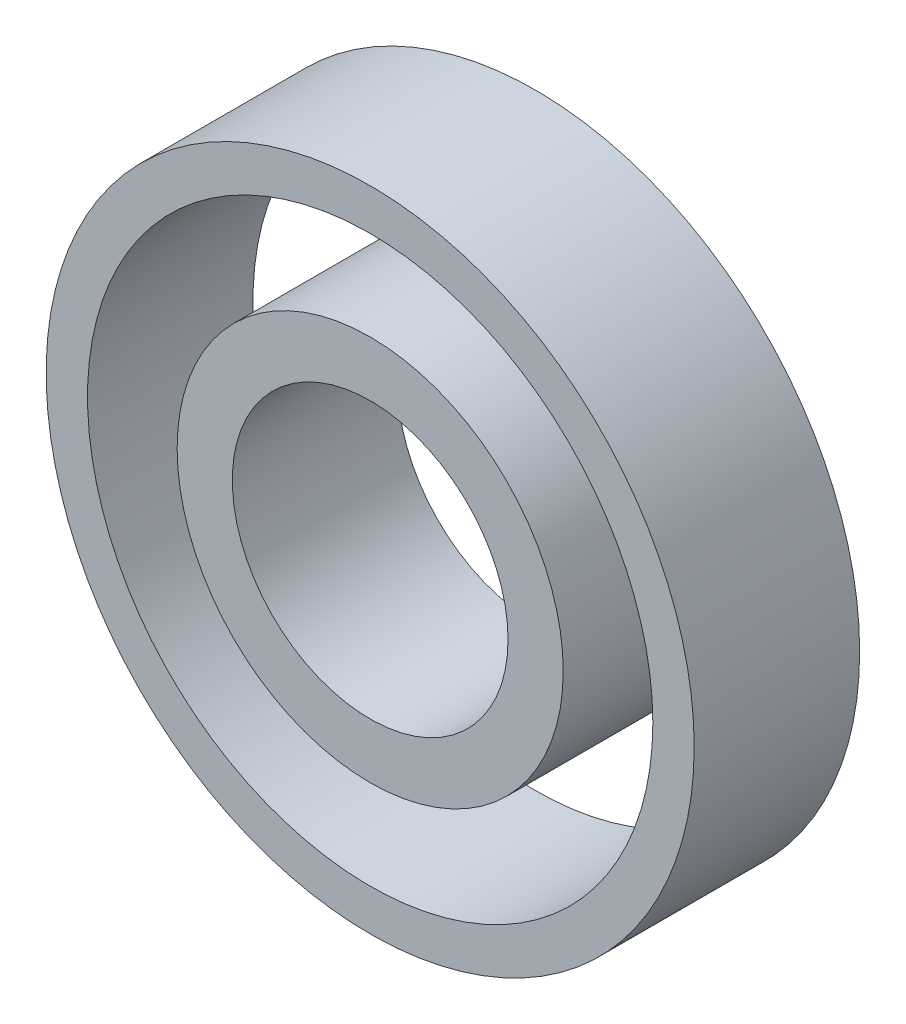
ISO-10303-21;
HEADER;
FILE_DESCRIPTION(('STEP AP214'),'2;1');
FILE_NAME('part.step','',(''),(''),'','','');
FILE_SCHEMA(('AUTOMOTIVE_DESIGN { 1 0 10303 214 1 1 1 1 }'));
ENDSEC;
DATA;
#1=APPLICATION_CONTEXT('core data for automotive mechanical design processes');
#2=APPLICATION_PROTOCOL_DEFINITION('international standard','automotive_design',2000,#1);
#3=PRODUCT_CONTEXT('',#1,'mechanical');
#4=PRODUCT('Part','Part','',(#3));
#5=PRODUCT_RELATED_PRODUCT_CATEGORY('part','',(#4));
#6=PRODUCT_DEFINITION_FORMATION('','',#4);
#7=PRODUCT_DEFINITION_CONTEXT('part definition',#1,'design');
#8=PRODUCT_DEFINITION('design','',#6,#7);
#9=PRODUCT_DEFINITION_SHAPE('','',#8);
#10=(LENGTH_UNIT() NAMED_UNIT(*) SI_UNIT(.MILLI.,.METRE.));
#11=(NAMED_UNIT(*) PLANE_ANGLE_UNIT() SI_UNIT($,.RADIAN.));
#12=(NAMED_UNIT(*) SI_UNIT($,.STERADIAN.) SOLID_ANGLE_UNIT());
#13=UNCERTAINTY_MEASURE_WITH_UNIT(LENGTH_MEASURE(1.E-05),#10,'distance_accuracy_value','');
#14=(GEOMETRIC_REPRESENTATION_CONTEXT(3) GLOBAL_UNCERTAINTY_ASSIGNED_CONTEXT((#13)) GLOBAL_UNIT_ASSIGNED_CONTEXT((#10,
#11,#12)) REPRESENTATION_CONTEXT('',''));
#15=CARTESIAN_POINT('',(0.,0.,0.));
#16=DIRECTION('',(0.,0.,1.));
#17=DIRECTION('',(1.,0.,0.));
#18=AXIS2_PLACEMENT_3D('',#15,#16,#17);
#19=CARTESIAN_POINT('',(0.,0.,0.));
#20=DIRECTION('',(0.,0.,1.));
#21=DIRECTION('',(1.,0.,0.));
#22=AXIS2_PLACEMENT_3D('',#19,#20,#21);
#23=CYLINDRICAL_SURFACE('',#22,14.);
#24=CARTESIAN_POINT('',(0.,0.,0.));
#25=DIRECTION('',(0.,0.,1.));
#26=DIRECTION('',(1.,0.,0.));
#27=AXIS2_PLACEMENT_3D('',#24,#25,#26);
#28=CIRCLE('',#27,14.);
#29=CARTESIAN_POINT('',(14.,0.,0.));
#30=VERTEX_POINT('',#29);
#31=EDGE_CURVE('E11',#30,#30,#28,.T.);
#32=ORIENTED_EDGE('',*,*,#31,.T.);
#33=EDGE_LOOP('',(#32));
#34=FACE_BOUND('',#33,.T.);
#35=CARTESIAN_POINT('',(0.,0.,12.));
#36=DIRECTION('',(0.,0.,1.));
#37=DIRECTION('',(1.,0.,0.));
#38=AXIS2_PLACEMENT_3D('',#35,#36,#37);
#39=CIRCLE('',#38,14.);
#40=CARTESIAN_POINT('',(14.,0.,12.));
#41=VERTEX_POINT('',#40);
#42=EDGE_CURVE('E53',#41,#41,#39,.T.);
#43=ORIENTED_EDGE('',*,*,#42,.F.);
#44=EDGE_LOOP('',(#43));
#45=FACE_BOUND('',#44,.T.);
#46=ADVANCED_FACE('F50',(#34,#45),#23,.T.);
#47=CARTESIAN_POINT('',(0.,0.,0.));
#48=DIRECTION('',(0.,0.,1.));
#49=DIRECTION('',(1.,0.,0.));
#50=AXIS2_PLACEMENT_3D('',#47,#48,#49);
#51=PLANE('',#50);
#52=CARTESIAN_POINT('',(0.,0.,0.));
#53=DIRECTION('',(0.,0.,1.));
#54=DIRECTION('',(1.,0.,0.));
#55=AXIS2_PLACEMENT_3D('',#52,#53,#54);
#56=CIRCLE('',#55,10.);
#57=CARTESIAN_POINT('',(10.,0.,0.));
#58=VERTEX_POINT('',#57);
#59=EDGE_CURVE('E60',#58,#58,#56,.T.);
#60=ORIENTED_EDGE('',*,*,#59,.T.);
#61=EDGE_LOOP('',(#60));
#62=FACE_BOUND('',#61,.T.);
#63=ORIENTED_EDGE('',*,*,#31,.F.);
#64=EDGE_LOOP('',(#63));
#65=FACE_BOUND('',#64,.T.);
#66=ADVANCED_FACE('F68',(#62,#65),#51,.F.);
#67=CARTESIAN_POINT('',(0.,0.,12.));
#68=DIRECTION('',(0.,0.,1.));
#69=DIRECTION('',(1.,0.,0.));
#70=AXIS2_PLACEMENT_3D('',#67,#68,#69);
#71=PLANE('',#70);
#72=CARTESIAN_POINT('',(0.,0.,12.));
#73=DIRECTION('',(0.,0.,1.));
#74=DIRECTION('',(1.,0.,0.));
#75=AXIS2_PLACEMENT_3D('',#72,#73,#74);
#76=CIRCLE('',#75,10.);
#77=CARTESIAN_POINT('',(10.,0.,12.));
#78=VERTEX_POINT('',#77);
#79=EDGE_CURVE('E62',#78,#78,#76,.T.);
#80=ORIENTED_EDGE('',*,*,#79,.F.);
#81=EDGE_LOOP('',(#80));
#82=FACE_BOUND('',#81,.T.);
#83=ORIENTED_EDGE('',*,*,#42,.T.);
#84=EDGE_LOOP('',(#83));
#85=FACE_BOUND('',#84,.T.);
#86=ADVANCED_FACE('F74',(#82,#85),#71,.T.);
#87=CARTESIAN_POINT('',(0.,0.,0.));
#88=DIRECTION('',(0.,0.,1.));
#89=DIRECTION('',(1.,0.,0.));
#90=AXIS2_PLACEMENT_3D('',#87,#88,#89);
#91=CYLINDRICAL_SURFACE('',#90,10.);
#92=ORIENTED_EDGE('',*,*,#59,.F.);
#93=EDGE_LOOP('',(#92));
#94=FACE_BOUND('',#93,.T.);
#95=ORIENTED_EDGE('',*,*,#79,.T.);
#96=EDGE_LOOP('',(#95));
#97=FACE_BOUND('',#96,.T.);
#98=ADVANCED_FACE('F71',(#94,#97),#91,.F.);
#99=CLOSED_SHELL('',(#46,#66,#86,#98));
#100=MANIFOLD_SOLID_BREP('B2',#99);
#101=CARTESIAN_POINT('',(0.,0.,12.));
#102=DIRECTION('',(0.,0.,1.));
#103=DIRECTION('',(1.,0.,0.));
#104=AXIS2_PLACEMENT_3D('',#101,#102,#103);
#105=PLANE('',#104);
#106=CARTESIAN_POINT('',(0.,0.,12.));
#107=DIRECTION('',(0.,0.,1.));
#108=DIRECTION('',(1.,0.,0.));
#109=AXIS2_PLACEMENT_3D('',#106,#107,#108);
#110=CIRCLE('',#109,23.5);
#111=CARTESIAN_POINT('',(23.5,0.,12.));
#112=VERTEX_POINT('',#111);
#113=EDGE_CURVE('E49',#112,#112,#110,.T.);
#114=ORIENTED_EDGE('',*,*,#113,.T.);
#115=EDGE_LOOP('',(#114));
#116=FACE_BOUND('',#115,.T.);
#117=CARTESIAN_POINT('',(0.,0.,12.));
#118=DIRECTION('',(0.,0.,1.));
#119=DIRECTION('',(1.,0.,0.));
#120=AXIS2_PLACEMENT_3D('',#117,#118,#119);
#121=CIRCLE('',#120,20.5);
#122=CARTESIAN_POINT('',(20.5,0.,12.));
#123=VERTEX_POINT('',#122);
#124=EDGE_CURVE('E145',#123,#123,#121,.T.);
#125=ORIENTED_EDGE('',*,*,#124,.F.);
#126=EDGE_LOOP('',(#125));
#127=FACE_BOUND('',#126,.T.);
#128=ADVANCED_FACE('F134',(#116,#127),#105,.T.);
#129=CARTESIAN_POINT('',(0.,0.,0.));
#130=DIRECTION('',(0.,0.,1.));
#131=DIRECTION('',(1.,0.,0.));
#132=AXIS2_PLACEMENT_3D('',#129,#130,#131);
#133=PLANE('',#132);
#134=CARTESIAN_POINT('',(0.,0.,0.));
#135=DIRECTION('',(0.,0.,1.));
#136=DIRECTION('',(1.,0.,0.));
#137=AXIS2_PLACEMENT_3D('',#134,#135,#136);
#138=CIRCLE('',#137,23.5);
#139=CARTESIAN_POINT('',(23.5,0.,0.));
#140=VERTEX_POINT('',#139);
#141=EDGE_CURVE('E138',#140,#140,#138,.T.);
#142=ORIENTED_EDGE('',*,*,#141,.F.);
#143=EDGE_LOOP('',(#142));
#144=FACE_BOUND('',#143,.T.);
#145=CARTESIAN_POINT('',(0.,0.,0.));
#146=DIRECTION('',(0.,0.,1.));
#147=DIRECTION('',(1.,0.,0.));
#148=AXIS2_PLACEMENT_3D('',#145,#146,#147);
#149=CIRCLE('',#148,20.5);
#150=CARTESIAN_POINT('',(20.5,0.,0.));
#151=VERTEX_POINT('',#150);
#152=EDGE_CURVE('E147',#151,#151,#149,.T.);
#153=ORIENTED_EDGE('',*,*,#152,.T.);
#154=EDGE_LOOP('',(#153));
#155=FACE_BOUND('',#154,.T.);
#156=ADVANCED_FACE('F157',(#144,#155),#133,.F.);
#157=CARTESIAN_POINT('',(0.,0.,12.));
#158=DIRECTION('',(0.,0.,-1.));
#159=DIRECTION('',(-1.,0.,0.));
#160=AXIS2_PLACEMENT_3D('',#157,#158,#159);
#161=CYLINDRICAL_SURFACE('',#160,23.5);
#162=ORIENTED_EDGE('',*,*,#113,.F.);
#163=EDGE_LOOP('',(#162));
#164=FACE_BOUND('',#163,.T.);
#165=ORIENTED_EDGE('',*,*,#141,.T.);
#166=EDGE_LOOP('',(#165));
#167=FACE_BOUND('',#166,.T.);
#168=ADVANCED_FACE('F136',(#164,#167),#161,.T.);
#169=CARTESIAN_POINT('',(0.,0.,12.));
#170=DIRECTION('',(0.,0.,-1.));
#171=DIRECTION('',(-1.,0.,0.));
#172=AXIS2_PLACEMENT_3D('',#169,#170,#171);
#173=CYLINDRICAL_SURFACE('',#172,20.5);
#174=ORIENTED_EDGE('',*,*,#124,.T.);
#175=EDGE_LOOP('',(#174));
#176=FACE_BOUND('',#175,.T.);
#177=ORIENTED_EDGE('',*,*,#152,.F.);
#178=EDGE_LOOP('',(#177));
#179=FACE_BOUND('',#178,.T.);
#180=ADVANCED_FACE('F153',(#176,#179),#173,.F.);
#181=CLOSED_SHELL('',(#128,#156,#168,#180));
#182=MANIFOLD_SOLID_BREP('B6',#181);
#183=ADVANCED_BREP_SHAPE_REPRESENTATION('',(#18,#100,#182),#14);
#184=SHAPE_DEFINITION_REPRESENTATION(#9,#183);
ENDSEC;
END-ISO-10303-21;
